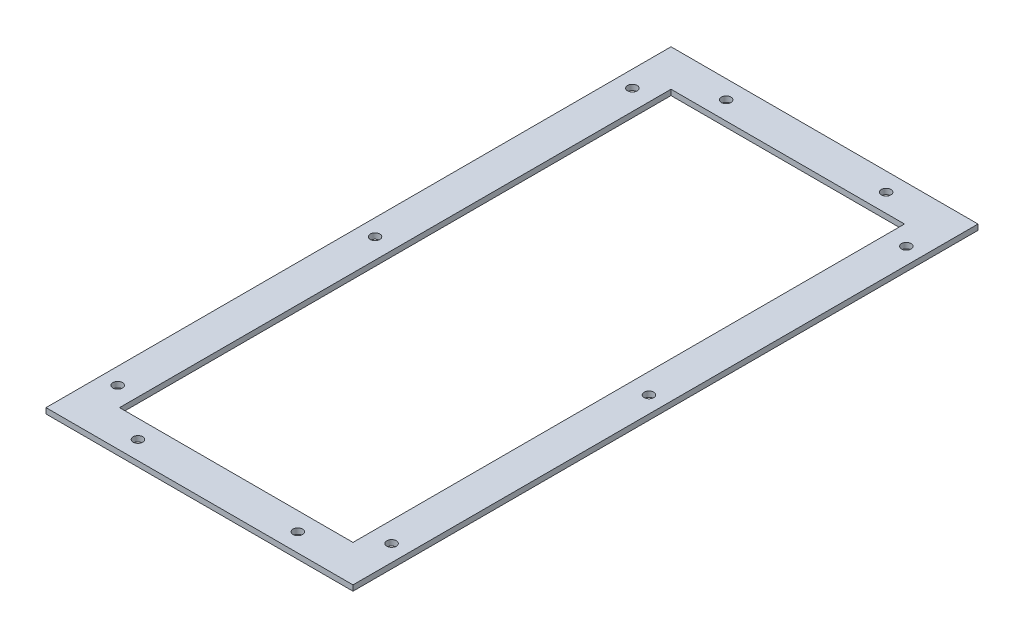
ISO-10303-21;
HEADER;
FILE_DESCRIPTION(('STEP AP214'),'2;1');
FILE_NAME('part.step','',(''),(''),'','','');
FILE_SCHEMA(('AUTOMOTIVE_DESIGN { 1 0 10303 214 1 1 1 1 }'));
ENDSEC;
DATA;
#1=APPLICATION_CONTEXT('core data for automotive mechanical design processes');
#2=APPLICATION_PROTOCOL_DEFINITION('international standard','automotive_design',2000,#1);
#3=PRODUCT_CONTEXT('',#1,'mechanical');
#4=PRODUCT('Part','Part','',(#3));
#5=PRODUCT_RELATED_PRODUCT_CATEGORY('part','',(#4));
#6=PRODUCT_DEFINITION_FORMATION('','',#4);
#7=PRODUCT_DEFINITION_CONTEXT('part definition',#1,'design');
#8=PRODUCT_DEFINITION('design','',#6,#7);
#9=PRODUCT_DEFINITION_SHAPE('','',#8);
#10=(LENGTH_UNIT() NAMED_UNIT(*) SI_UNIT(.MILLI.,.METRE.));
#11=(NAMED_UNIT(*) PLANE_ANGLE_UNIT() SI_UNIT($,.RADIAN.));
#12=(NAMED_UNIT(*) SI_UNIT($,.STERADIAN.) SOLID_ANGLE_UNIT());
#13=UNCERTAINTY_MEASURE_WITH_UNIT(LENGTH_MEASURE(1.E-05),#10,'distance_accuracy_value','');
#14=(GEOMETRIC_REPRESENTATION_CONTEXT(3) GLOBAL_UNCERTAINTY_ASSIGNED_CONTEXT((#13)) GLOBAL_UNIT_ASSIGNED_CONTEXT((#10,
#11,#12)) REPRESENTATION_CONTEXT('',''));
#15=CARTESIAN_POINT('',(0.,0.,0.));
#16=DIRECTION('',(0.,0.,1.));
#17=DIRECTION('',(1.,0.,0.));
#18=AXIS2_PLACEMENT_3D('',#15,#16,#17);
#19=CARTESIAN_POINT('',(0.,3.,0.));
#20=DIRECTION('',(0.,1.,0.));
#21=DIRECTION('',(0.,0.,1.));
#22=AXIS2_PLACEMENT_3D('',#19,#20,#21);
#23=PLANE('',#22);
#24=DIRECTION('',(-1.,0.,0.));
#25=VECTOR('',#24,1.);
#26=CARTESIAN_POINT('',(63.5,3.,-150.));
#27=LINE('',#26,#25);
#28=CARTESIAN_POINT('',(63.5,3.,-150.));
#29=VERTEX_POINT('',#28);
#30=CARTESIAN_POINT('',(-63.5,3.,-150.));
#31=VERTEX_POINT('',#30);
#32=EDGE_CURVE('E52',#29,#31,#27,.T.);
#33=ORIENTED_EDGE('',*,*,#32,.F.);
#34=DIRECTION('',(0.,0.,-1.));
#35=VECTOR('',#34,1.);
#36=CARTESIAN_POINT('',(63.5,3.,150.));
#37=LINE('',#36,#35);
#38=CARTESIAN_POINT('',(63.5,3.,150.));
#39=VERTEX_POINT('',#38);
#40=EDGE_CURVE('E120',#39,#29,#37,.T.);
#41=ORIENTED_EDGE('',*,*,#40,.F.);
#42=DIRECTION('',(1.,0.,0.));
#43=VECTOR('',#42,1.);
#44=CARTESIAN_POINT('',(-63.5,3.,150.));
#45=LINE('',#44,#43);
#46=CARTESIAN_POINT('',(-63.5,3.,150.));
#47=VERTEX_POINT('',#46);
#48=EDGE_CURVE('E105',#47,#39,#45,.T.);
#49=ORIENTED_EDGE('',*,*,#48,.F.);
#50=DIRECTION('',(0.,0.,1.));
#51=VECTOR('',#50,1.);
#52=CARTESIAN_POINT('',(-63.5,3.,-150.));
#53=LINE('',#52,#51);
#54=EDGE_CURVE('E114',#31,#47,#53,.T.);
#55=ORIENTED_EDGE('',*,*,#54,.F.);
#56=EDGE_LOOP('',(#33,#41,#49,#55));
#57=FACE_BOUND('',#56,.T.);
#58=CARTESIAN_POINT('',(-43.5,3.,160.));
#59=DIRECTION('',(0.,1.,0.));
#60=DIRECTION('',(0.,0.,1.));
#61=AXIS2_PLACEMENT_3D('',#58,#59,#60);
#62=CIRCLE('',#61,2.59999999999998);
#63=CARTESIAN_POINT('',(-43.5,3.,162.6));
#64=VERTEX_POINT('',#63);
#65=EDGE_CURVE('E136',#64,#64,#62,.T.);
#66=ORIENTED_EDGE('',*,*,#65,.F.);
#67=EDGE_LOOP('',(#66));
#68=FACE_BOUND('',#67,.T.);
#69=CARTESIAN_POINT('',(-43.5,3.,-160.));
#70=DIRECTION('',(0.,1.,0.));
#71=DIRECTION('',(0.,0.,1.));
#72=AXIS2_PLACEMENT_3D('',#69,#70,#71);
#73=CIRCLE('',#72,2.59999999999997);
#74=CARTESIAN_POINT('',(-43.5,3.,-157.4));
#75=VERTEX_POINT('',#74);
#76=EDGE_CURVE('E148',#75,#75,#73,.T.);
#77=ORIENTED_EDGE('',*,*,#76,.F.);
#78=EDGE_LOOP('',(#77));
#79=FACE_BOUND('',#78,.T.);
#80=CARTESIAN_POINT('',(74.5000000000001,3.,0.));
#81=DIRECTION('',(0.,1.,0.));
#82=DIRECTION('',(0.,0.,1.));
#83=AXIS2_PLACEMENT_3D('',#80,#81,#82);
#84=CIRCLE('',#83,2.6);
#85=CARTESIAN_POINT('',(74.5000000000001,3.,2.6));
#86=VERTEX_POINT('',#85);
#87=EDGE_CURVE('E160',#86,#86,#84,.T.);
#88=ORIENTED_EDGE('',*,*,#87,.F.);
#89=EDGE_LOOP('',(#88));
#90=FACE_BOUND('',#89,.T.);
#91=CARTESIAN_POINT('',(-74.5,3.,140.));
#92=DIRECTION('',(0.,1.,0.));
#93=DIRECTION('',(0.,0.,1.));
#94=AXIS2_PLACEMENT_3D('',#91,#92,#93);
#95=CIRCLE('',#94,2.6);
#96=CARTESIAN_POINT('',(-74.5,3.,142.6));
#97=VERTEX_POINT('',#96);
#98=EDGE_CURVE('E172',#97,#97,#95,.T.);
#99=ORIENTED_EDGE('',*,*,#98,.F.);
#100=EDGE_LOOP('',(#99));
#101=FACE_BOUND('',#100,.T.);
#102=CARTESIAN_POINT('',(-74.5000000000001,3.,-140.));
#103=DIRECTION('',(0.,1.,0.));
#104=DIRECTION('',(0.,0.,1.));
#105=AXIS2_PLACEMENT_3D('',#102,#103,#104);
#106=CIRCLE('',#105,2.6);
#107=CARTESIAN_POINT('',(-74.5000000000001,3.,-137.4));
#108=VERTEX_POINT('',#107);
#109=EDGE_CURVE('E184',#108,#108,#106,.T.);
#110=ORIENTED_EDGE('',*,*,#109,.F.);
#111=EDGE_LOOP('',(#110));
#112=FACE_BOUND('',#111,.T.);
#113=DIRECTION('',(0.,0.,1.));
#114=VECTOR('',#113,1.);
#115=CARTESIAN_POINT('',(-83.5,3.,-170.));
#116=LINE('',#115,#114);
#117=CARTESIAN_POINT('',(-83.5,3.,-170.));
#118=VERTEX_POINT('',#117);
#119=CARTESIAN_POINT('',(-83.5,3.,170.));
#120=VERTEX_POINT('',#119);
#121=EDGE_CURVE('E190',#118,#120,#116,.T.);
#122=ORIENTED_EDGE('',*,*,#121,.T.);
#123=DIRECTION('',(1.,0.,0.));
#124=VECTOR('',#123,1.);
#125=CARTESIAN_POINT('',(-83.5,3.,170.));
#126=LINE('',#125,#124);
#127=CARTESIAN_POINT('',(83.5,3.,170.));
#128=VERTEX_POINT('',#127);
#129=EDGE_CURVE('E193',#120,#128,#126,.T.);
#130=ORIENTED_EDGE('',*,*,#129,.T.);
#131=DIRECTION('',(0.,0.,-1.));
#132=VECTOR('',#131,1.);
#133=CARTESIAN_POINT('',(83.5,3.,-170.));
#134=LINE('',#133,#132);
#135=CARTESIAN_POINT('',(83.5,3.,-170.));
#136=VERTEX_POINT('',#135);
#137=EDGE_CURVE('E196',#128,#136,#134,.T.);
#138=ORIENTED_EDGE('',*,*,#137,.T.);
#139=DIRECTION('',(-1.,0.,0.));
#140=VECTOR('',#139,1.);
#141=CARTESIAN_POINT('',(-83.5,3.,-170.));
#142=LINE('',#141,#140);
#143=EDGE_CURVE('E198',#136,#118,#142,.T.);
#144=ORIENTED_EDGE('',*,*,#143,.T.);
#145=EDGE_LOOP('',(#122,#130,#138,#144));
#146=FACE_BOUND('',#145,.T.);
#147=CARTESIAN_POINT('',(-74.5,3.,0.));
#148=DIRECTION('',(0.,1.,0.));
#149=DIRECTION('',(0.,0.,1.));
#150=AXIS2_PLACEMENT_3D('',#147,#148,#149);
#151=CIRCLE('',#150,2.6);
#152=CARTESIAN_POINT('',(-74.5,3.,2.6));
#153=VERTEX_POINT('',#152);
#154=EDGE_CURVE('E178',#153,#153,#151,.T.);
#155=ORIENTED_EDGE('',*,*,#154,.F.);
#156=EDGE_LOOP('',(#155));
#157=FACE_BOUND('',#156,.T.);
#158=CARTESIAN_POINT('',(74.5000000000001,3.,-140.));
#159=DIRECTION('',(0.,1.,0.));
#160=DIRECTION('',(0.,0.,1.));
#161=AXIS2_PLACEMENT_3D('',#158,#159,#160);
#162=CIRCLE('',#161,2.6);
#163=CARTESIAN_POINT('',(74.5000000000001,3.,-137.4));
#164=VERTEX_POINT('',#163);
#165=EDGE_CURVE('E166',#164,#164,#162,.T.);
#166=ORIENTED_EDGE('',*,*,#165,.F.);
#167=EDGE_LOOP('',(#166));
#168=FACE_BOUND('',#167,.T.);
#169=CARTESIAN_POINT('',(74.5000000000001,3.,140.));
#170=DIRECTION('',(0.,1.,0.));
#171=DIRECTION('',(0.,0.,1.));
#172=AXIS2_PLACEMENT_3D('',#169,#170,#171);
#173=CIRCLE('',#172,2.6);
#174=CARTESIAN_POINT('',(74.5000000000001,3.,142.6));
#175=VERTEX_POINT('',#174);
#176=EDGE_CURVE('E154',#175,#175,#173,.T.);
#177=ORIENTED_EDGE('',*,*,#176,.F.);
#178=EDGE_LOOP('',(#177));
#179=FACE_BOUND('',#178,.T.);
#180=CARTESIAN_POINT('',(43.5000000000001,3.,-160.));
#181=DIRECTION('',(0.,1.,0.));
#182=DIRECTION('',(0.,0.,1.));
#183=AXIS2_PLACEMENT_3D('',#180,#181,#182);
#184=CIRCLE('',#183,2.59999999999997);
#185=CARTESIAN_POINT('',(43.5000000000001,3.,-157.4));
#186=VERTEX_POINT('',#185);
#187=EDGE_CURVE('E142',#186,#186,#184,.T.);
#188=ORIENTED_EDGE('',*,*,#187,.F.);
#189=EDGE_LOOP('',(#188));
#190=FACE_BOUND('',#189,.T.);
#191=CARTESIAN_POINT('',(43.5000000000001,3.,160.));
#192=DIRECTION('',(0.,1.,0.));
#193=DIRECTION('',(0.,0.,1.));
#194=AXIS2_PLACEMENT_3D('',#191,#192,#193);
#195=CIRCLE('',#194,2.59999999999997);
#196=CARTESIAN_POINT('',(43.5000000000001,3.,162.6));
#197=VERTEX_POINT('',#196);
#198=EDGE_CURVE('E130',#197,#197,#195,.T.);
#199=ORIENTED_EDGE('',*,*,#198,.F.);
#200=EDGE_LOOP('',(#199));
#201=FACE_BOUND('',#200,.T.);
#202=ADVANCED_FACE('F37',(#57,#68,#79,#90,#101,#112,#146,#157,#168,#179,#190,#201),#23,.T.);
#203=CARTESIAN_POINT('',(0.,0.,0.));
#204=DIRECTION('',(0.,1.,0.));
#205=DIRECTION('',(0.,0.,1.));
#206=AXIS2_PLACEMENT_3D('',#203,#204,#205);
#207=PLANE('',#206);
#208=DIRECTION('',(0.,0.,-1.));
#209=VECTOR('',#208,1.);
#210=CARTESIAN_POINT('',(63.5,0.,0.));
#211=LINE('',#210,#209);
#212=CARTESIAN_POINT('',(63.5,0.,150.));
#213=VERTEX_POINT('',#212);
#214=CARTESIAN_POINT('',(63.5,0.,-150.));
#215=VERTEX_POINT('',#214);
#216=EDGE_CURVE('E45',#213,#215,#211,.T.);
#217=ORIENTED_EDGE('',*,*,#216,.T.);
#218=DIRECTION('',(-1.,0.,0.));
#219=VECTOR('',#218,1.);
#220=CARTESIAN_POINT('',(0.,0.,-150.));
#221=LINE('',#220,#219);
#222=CARTESIAN_POINT('',(-63.5,0.,-150.));
#223=VERTEX_POINT('',#222);
#224=EDGE_CURVE('E11',#215,#223,#221,.T.);
#225=ORIENTED_EDGE('',*,*,#224,.T.);
#226=DIRECTION('',(0.,0.,1.));
#227=VECTOR('',#226,1.);
#228=CARTESIAN_POINT('',(-63.5,0.,0.));
#229=LINE('',#228,#227);
#230=CARTESIAN_POINT('',(-63.5,0.,150.));
#231=VERTEX_POINT('',#230);
#232=EDGE_CURVE('E219',#223,#231,#229,.T.);
#233=ORIENTED_EDGE('',*,*,#232,.T.);
#234=DIRECTION('',(1.,0.,0.));
#235=VECTOR('',#234,1.);
#236=CARTESIAN_POINT('',(0.,0.,150.));
#237=LINE('',#236,#235);
#238=EDGE_CURVE('E108',#231,#213,#237,.T.);
#239=ORIENTED_EDGE('',*,*,#238,.T.);
#240=EDGE_LOOP('',(#217,#225,#233,#239));
#241=FACE_BOUND('',#240,.T.);
#242=DIRECTION('',(0.,0.,1.));
#243=VECTOR('',#242,1.);
#244=CARTESIAN_POINT('',(-83.5,0.,-170.));
#245=LINE('',#244,#243);
#246=CARTESIAN_POINT('',(-83.5,0.,-170.));
#247=VERTEX_POINT('',#246);
#248=CARTESIAN_POINT('',(-83.5,0.,170.));
#249=VERTEX_POINT('',#248);
#250=EDGE_CURVE('E187',#247,#249,#245,.T.);
#251=ORIENTED_EDGE('',*,*,#250,.F.);
#252=DIRECTION('',(-1.,0.,0.));
#253=VECTOR('',#252,1.);
#254=CARTESIAN_POINT('',(-83.5,0.,-170.));
#255=LINE('',#254,#253);
#256=CARTESIAN_POINT('',(83.5,0.,-170.));
#257=VERTEX_POINT('',#256);
#258=EDGE_CURVE('E194',#257,#247,#255,.T.);
#259=ORIENTED_EDGE('',*,*,#258,.F.);
#260=DIRECTION('',(0.,0.,-1.));
#261=VECTOR('',#260,1.);
#262=CARTESIAN_POINT('',(83.5,0.,-170.));
#263=LINE('',#262,#261);
#264=CARTESIAN_POINT('',(83.5,0.,170.));
#265=VERTEX_POINT('',#264);
#266=EDGE_CURVE('E205',#265,#257,#263,.T.);
#267=ORIENTED_EDGE('',*,*,#266,.F.);
#268=DIRECTION('',(1.,0.,0.));
#269=VECTOR('',#268,1.);
#270=CARTESIAN_POINT('',(-83.5,0.,170.));
#271=LINE('',#270,#269);
#272=EDGE_CURVE('E203',#249,#265,#271,.T.);
#273=ORIENTED_EDGE('',*,*,#272,.F.);
#274=EDGE_LOOP('',(#251,#259,#267,#273));
#275=FACE_BOUND('',#274,.T.);
#276=CARTESIAN_POINT('',(-74.5000000000001,0.,-140.));
#277=DIRECTION('',(0.,1.,0.));
#278=DIRECTION('',(0.,0.,1.));
#279=AXIS2_PLACEMENT_3D('',#276,#277,#278);
#280=CIRCLE('',#279,2.6);
#281=CARTESIAN_POINT('',(-74.5000000000001,0.,-137.4));
#282=VERTEX_POINT('',#281);
#283=EDGE_CURVE('E181',#282,#282,#280,.T.);
#284=ORIENTED_EDGE('',*,*,#283,.T.);
#285=EDGE_LOOP('',(#284));
#286=FACE_BOUND('',#285,.T.);
#287=CARTESIAN_POINT('',(-74.5,0.,0.));
#288=DIRECTION('',(0.,1.,0.));
#289=DIRECTION('',(0.,0.,1.));
#290=AXIS2_PLACEMENT_3D('',#287,#288,#289);
#291=CIRCLE('',#290,2.6);
#292=CARTESIAN_POINT('',(-74.5,0.,2.6));
#293=VERTEX_POINT('',#292);
#294=EDGE_CURVE('E175',#293,#293,#291,.T.);
#295=ORIENTED_EDGE('',*,*,#294,.T.);
#296=EDGE_LOOP('',(#295));
#297=FACE_BOUND('',#296,.T.);
#298=CARTESIAN_POINT('',(-74.5,0.,140.));
#299=DIRECTION('',(0.,1.,0.));
#300=DIRECTION('',(0.,0.,1.));
#301=AXIS2_PLACEMENT_3D('',#298,#299,#300);
#302=CIRCLE('',#301,2.6);
#303=CARTESIAN_POINT('',(-74.5,0.,142.6));
#304=VERTEX_POINT('',#303);
#305=EDGE_CURVE('E169',#304,#304,#302,.T.);
#306=ORIENTED_EDGE('',*,*,#305,.T.);
#307=EDGE_LOOP('',(#306));
#308=FACE_BOUND('',#307,.T.);
#309=CARTESIAN_POINT('',(74.5000000000001,0.,-140.));
#310=DIRECTION('',(0.,1.,0.));
#311=DIRECTION('',(0.,0.,1.));
#312=AXIS2_PLACEMENT_3D('',#309,#310,#311);
#313=CIRCLE('',#312,2.6);
#314=CARTESIAN_POINT('',(74.5000000000001,0.,-137.4));
#315=VERTEX_POINT('',#314);
#316=EDGE_CURVE('E163',#315,#315,#313,.T.);
#317=ORIENTED_EDGE('',*,*,#316,.T.);
#318=EDGE_LOOP('',(#317));
#319=FACE_BOUND('',#318,.T.);
#320=CARTESIAN_POINT('',(74.5000000000001,0.,0.));
#321=DIRECTION('',(0.,1.,0.));
#322=DIRECTION('',(0.,0.,1.));
#323=AXIS2_PLACEMENT_3D('',#320,#321,#322);
#324=CIRCLE('',#323,2.6);
#325=CARTESIAN_POINT('',(74.5000000000001,0.,2.6));
#326=VERTEX_POINT('',#325);
#327=EDGE_CURVE('E157',#326,#326,#324,.T.);
#328=ORIENTED_EDGE('',*,*,#327,.T.);
#329=EDGE_LOOP('',(#328));
#330=FACE_BOUND('',#329,.T.);
#331=CARTESIAN_POINT('',(74.5000000000001,0.,140.));
#332=DIRECTION('',(0.,1.,0.));
#333=DIRECTION('',(0.,0.,1.));
#334=AXIS2_PLACEMENT_3D('',#331,#332,#333);
#335=CIRCLE('',#334,2.6);
#336=CARTESIAN_POINT('',(74.5000000000001,0.,142.6));
#337=VERTEX_POINT('',#336);
#338=EDGE_CURVE('E151',#337,#337,#335,.T.);
#339=ORIENTED_EDGE('',*,*,#338,.T.);
#340=EDGE_LOOP('',(#339));
#341=FACE_BOUND('',#340,.T.);
#342=CARTESIAN_POINT('',(-43.5,0.,-160.));
#343=DIRECTION('',(0.,1.,0.));
#344=DIRECTION('',(0.,0.,1.));
#345=AXIS2_PLACEMENT_3D('',#342,#343,#344);
#346=CIRCLE('',#345,2.59999999999997);
#347=CARTESIAN_POINT('',(-43.5,0.,-157.4));
#348=VERTEX_POINT('',#347);
#349=EDGE_CURVE('E145',#348,#348,#346,.T.);
#350=ORIENTED_EDGE('',*,*,#349,.T.);
#351=EDGE_LOOP('',(#350));
#352=FACE_BOUND('',#351,.T.);
#353=CARTESIAN_POINT('',(43.5000000000001,0.,-160.));
#354=DIRECTION('',(0.,1.,0.));
#355=DIRECTION('',(0.,0.,1.));
#356=AXIS2_PLACEMENT_3D('',#353,#354,#355);
#357=CIRCLE('',#356,2.59999999999997);
#358=CARTESIAN_POINT('',(43.5000000000001,0.,-157.4));
#359=VERTEX_POINT('',#358);
#360=EDGE_CURVE('E139',#359,#359,#357,.T.);
#361=ORIENTED_EDGE('',*,*,#360,.T.);
#362=EDGE_LOOP('',(#361));
#363=FACE_BOUND('',#362,.T.);
#364=CARTESIAN_POINT('',(-43.5,0.,160.));
#365=DIRECTION('',(0.,1.,0.));
#366=DIRECTION('',(0.,0.,1.));
#367=AXIS2_PLACEMENT_3D('',#364,#365,#366);
#368=CIRCLE('',#367,2.59999999999998);
#369=CARTESIAN_POINT('',(-43.5,0.,162.6));
#370=VERTEX_POINT('',#369);
#371=EDGE_CURVE('E133',#370,#370,#368,.T.);
#372=ORIENTED_EDGE('',*,*,#371,.T.);
#373=EDGE_LOOP('',(#372));
#374=FACE_BOUND('',#373,.T.);
#375=CARTESIAN_POINT('',(43.5000000000001,0.,160.));
#376=DIRECTION('',(0.,1.,0.));
#377=DIRECTION('',(0.,0.,1.));
#378=AXIS2_PLACEMENT_3D('',#375,#376,#377);
#379=CIRCLE('',#378,2.59999999999997);
#380=CARTESIAN_POINT('',(43.5000000000001,0.,162.6));
#381=VERTEX_POINT('',#380);
#382=EDGE_CURVE('E127',#381,#381,#379,.T.);
#383=ORIENTED_EDGE('',*,*,#382,.T.);
#384=EDGE_LOOP('',(#383));
#385=FACE_BOUND('',#384,.T.);
#386=ADVANCED_FACE('F223',(#241,#275,#286,#297,#308,#319,#330,#341,#352,#363,#374,#385),#207,.F.);
#387=CARTESIAN_POINT('',(-83.5,3.,-170.));
#388=DIRECTION('',(1.,0.,0.));
#389=DIRECTION('',(0.,0.,-1.));
#390=AXIS2_PLACEMENT_3D('',#387,#388,#389);
#391=PLANE('',#390);
#392=ORIENTED_EDGE('',*,*,#250,.T.);
#393=DIRECTION('',(0.,-1.,0.));
#394=VECTOR('',#393,1.);
#395=CARTESIAN_POINT('',(-83.5,3.,170.));
#396=LINE('',#395,#394);
#397=EDGE_CURVE('E216',#120,#249,#396,.T.);
#398=ORIENTED_EDGE('',*,*,#397,.F.);
#399=ORIENTED_EDGE('',*,*,#121,.F.);
#400=DIRECTION('',(0.,-1.,0.));
#401=VECTOR('',#400,1.);
#402=CARTESIAN_POINT('',(-83.5,3.,-170.));
#403=LINE('',#402,#401);
#404=EDGE_CURVE('E200',#118,#247,#403,.T.);
#405=ORIENTED_EDGE('',*,*,#404,.T.);
#406=EDGE_LOOP('',(#392,#398,#399,#405));
#407=FACE_BOUND('',#406,.T.);
#408=ADVANCED_FACE('F39',(#407),#391,.F.);
#409=CARTESIAN_POINT('',(-83.5,3.,170.));
#410=DIRECTION('',(0.,0.,-1.));
#411=DIRECTION('',(-1.,0.,0.));
#412=AXIS2_PLACEMENT_3D('',#409,#410,#411);
#413=PLANE('',#412);
#414=ORIENTED_EDGE('',*,*,#272,.T.);
#415=DIRECTION('',(0.,-1.,0.));
#416=VECTOR('',#415,1.);
#417=CARTESIAN_POINT('',(83.5,3.,170.));
#418=LINE('',#417,#416);
#419=EDGE_CURVE('E213',#128,#265,#418,.T.);
#420=ORIENTED_EDGE('',*,*,#419,.F.);
#421=ORIENTED_EDGE('',*,*,#129,.F.);
#422=ORIENTED_EDGE('',*,*,#397,.T.);
#423=EDGE_LOOP('',(#414,#420,#421,#422));
#424=FACE_BOUND('',#423,.T.);
#425=ADVANCED_FACE('F258',(#424),#413,.F.);
#426=CARTESIAN_POINT('',(83.5,3.,-170.));
#427=DIRECTION('',(-1.,0.,0.));
#428=DIRECTION('',(0.,0.,1.));
#429=AXIS2_PLACEMENT_3D('',#426,#427,#428);
#430=PLANE('',#429);
#431=ORIENTED_EDGE('',*,*,#266,.T.);
#432=DIRECTION('',(0.,-1.,0.));
#433=VECTOR('',#432,1.);
#434=CARTESIAN_POINT('',(83.5,3.,-170.));
#435=LINE('',#434,#433);
#436=EDGE_CURVE('E210',#136,#257,#435,.T.);
#437=ORIENTED_EDGE('',*,*,#436,.F.);
#438=ORIENTED_EDGE('',*,*,#137,.F.);
#439=ORIENTED_EDGE('',*,*,#419,.T.);
#440=EDGE_LOOP('',(#431,#437,#438,#439));
#441=FACE_BOUND('',#440,.T.);
#442=ADVANCED_FACE('F255',(#441),#430,.F.);
#443=CARTESIAN_POINT('',(-83.5,3.,-170.));
#444=DIRECTION('',(0.,0.,1.));
#445=DIRECTION('',(1.,0.,0.));
#446=AXIS2_PLACEMENT_3D('',#443,#444,#445);
#447=PLANE('',#446);
#448=ORIENTED_EDGE('',*,*,#258,.T.);
#449=ORIENTED_EDGE('',*,*,#404,.F.);
#450=ORIENTED_EDGE('',*,*,#143,.F.);
#451=ORIENTED_EDGE('',*,*,#436,.T.);
#452=EDGE_LOOP('',(#448,#449,#450,#451));
#453=FACE_BOUND('',#452,.T.);
#454=ADVANCED_FACE('F252',(#453),#447,.F.);
#455=CARTESIAN_POINT('',(-74.5000000000001,3.,-140.));
#456=DIRECTION('',(0.,-1.,0.));
#457=DIRECTION('',(0.,0.,-1.));
#458=AXIS2_PLACEMENT_3D('',#455,#456,#457);
#459=CYLINDRICAL_SURFACE('',#458,2.6);
#460=ORIENTED_EDGE('',*,*,#109,.T.);
#461=EDGE_LOOP('',(#460));
#462=FACE_BOUND('',#461,.T.);
#463=ORIENTED_EDGE('',*,*,#283,.F.);
#464=EDGE_LOOP('',(#463));
#465=FACE_BOUND('',#464,.T.);
#466=ADVANCED_FACE('F249',(#462,#465),#459,.F.);
#467=CARTESIAN_POINT('',(-74.5,3.,0.));
#468=DIRECTION('',(0.,-1.,0.));
#469=DIRECTION('',(0.,0.,-1.));
#470=AXIS2_PLACEMENT_3D('',#467,#468,#469);
#471=CYLINDRICAL_SURFACE('',#470,2.6);
#472=ORIENTED_EDGE('',*,*,#154,.T.);
#473=EDGE_LOOP('',(#472));
#474=FACE_BOUND('',#473,.T.);
#475=ORIENTED_EDGE('',*,*,#294,.F.);
#476=EDGE_LOOP('',(#475));
#477=FACE_BOUND('',#476,.T.);
#478=ADVANCED_FACE('F325',(#474,#477),#471,.F.);
#479=CARTESIAN_POINT('',(-74.5,3.,140.));
#480=DIRECTION('',(0.,-1.,0.));
#481=DIRECTION('',(0.,0.,-1.));
#482=AXIS2_PLACEMENT_3D('',#479,#480,#481);
#483=CYLINDRICAL_SURFACE('',#482,2.6);
#484=ORIENTED_EDGE('',*,*,#98,.T.);
#485=EDGE_LOOP('',(#484));
#486=FACE_BOUND('',#485,.T.);
#487=ORIENTED_EDGE('',*,*,#305,.F.);
#488=EDGE_LOOP('',(#487));
#489=FACE_BOUND('',#488,.T.);
#490=ADVANCED_FACE('F322',(#486,#489),#483,.F.);
#491=CARTESIAN_POINT('',(74.5000000000001,3.,-140.));
#492=DIRECTION('',(0.,-1.,0.));
#493=DIRECTION('',(0.,0.,-1.));
#494=AXIS2_PLACEMENT_3D('',#491,#492,#493);
#495=CYLINDRICAL_SURFACE('',#494,2.6);
#496=ORIENTED_EDGE('',*,*,#165,.T.);
#497=EDGE_LOOP('',(#496));
#498=FACE_BOUND('',#497,.T.);
#499=ORIENTED_EDGE('',*,*,#316,.F.);
#500=EDGE_LOOP('',(#499));
#501=FACE_BOUND('',#500,.T.);
#502=ADVANCED_FACE('F318',(#498,#501),#495,.F.);
#503=CARTESIAN_POINT('',(74.5000000000001,3.,0.));
#504=DIRECTION('',(0.,-1.,0.));
#505=DIRECTION('',(0.,0.,-1.));
#506=AXIS2_PLACEMENT_3D('',#503,#504,#505);
#507=CYLINDRICAL_SURFACE('',#506,2.6);
#508=ORIENTED_EDGE('',*,*,#87,.T.);
#509=EDGE_LOOP('',(#508));
#510=FACE_BOUND('',#509,.T.);
#511=ORIENTED_EDGE('',*,*,#327,.F.);
#512=EDGE_LOOP('',(#511));
#513=FACE_BOUND('',#512,.T.);
#514=ADVANCED_FACE('F314',(#510,#513),#507,.F.);
#515=CARTESIAN_POINT('',(74.5000000000001,3.,140.));
#516=DIRECTION('',(0.,-1.,0.));
#517=DIRECTION('',(0.,0.,-1.));
#518=AXIS2_PLACEMENT_3D('',#515,#516,#517);
#519=CYLINDRICAL_SURFACE('',#518,2.6);
#520=ORIENTED_EDGE('',*,*,#176,.T.);
#521=EDGE_LOOP('',(#520));
#522=FACE_BOUND('',#521,.T.);
#523=ORIENTED_EDGE('',*,*,#338,.F.);
#524=EDGE_LOOP('',(#523));
#525=FACE_BOUND('',#524,.T.);
#526=ADVANCED_FACE('F310',(#522,#525),#519,.F.);
#527=CARTESIAN_POINT('',(-43.5,3.,-160.));
#528=DIRECTION('',(0.,-1.,0.));
#529=DIRECTION('',(0.,0.,-1.));
#530=AXIS2_PLACEMENT_3D('',#527,#528,#529);
#531=CYLINDRICAL_SURFACE('',#530,2.59999999999997);
#532=ORIENTED_EDGE('',*,*,#76,.T.);
#533=EDGE_LOOP('',(#532));
#534=FACE_BOUND('',#533,.T.);
#535=ORIENTED_EDGE('',*,*,#349,.F.);
#536=EDGE_LOOP('',(#535));
#537=FACE_BOUND('',#536,.T.);
#538=ADVANCED_FACE('F295',(#534,#537),#531,.F.);
#539=CARTESIAN_POINT('',(43.5000000000001,3.,-160.));
#540=DIRECTION('',(0.,-1.,0.));
#541=DIRECTION('',(0.,0.,-1.));
#542=AXIS2_PLACEMENT_3D('',#539,#540,#541);
#543=CYLINDRICAL_SURFACE('',#542,2.59999999999997);
#544=ORIENTED_EDGE('',*,*,#187,.T.);
#545=EDGE_LOOP('',(#544));
#546=FACE_BOUND('',#545,.T.);
#547=ORIENTED_EDGE('',*,*,#360,.F.);
#548=EDGE_LOOP('',(#547));
#549=FACE_BOUND('',#548,.T.);
#550=ADVANCED_FACE('F292',(#546,#549),#543,.F.);
#551=CARTESIAN_POINT('',(-43.5,3.,160.));
#552=DIRECTION('',(0.,-1.,0.));
#553=DIRECTION('',(0.,0.,-1.));
#554=AXIS2_PLACEMENT_3D('',#551,#552,#553);
#555=CYLINDRICAL_SURFACE('',#554,2.59999999999998);
#556=ORIENTED_EDGE('',*,*,#65,.T.);
#557=EDGE_LOOP('',(#556));
#558=FACE_BOUND('',#557,.T.);
#559=ORIENTED_EDGE('',*,*,#371,.F.);
#560=EDGE_LOOP('',(#559));
#561=FACE_BOUND('',#560,.T.);
#562=ADVANCED_FACE('F237',(#558,#561),#555,.F.);
#563=CARTESIAN_POINT('',(43.5000000000001,3.,160.));
#564=DIRECTION('',(0.,-1.,0.));
#565=DIRECTION('',(0.,0.,-1.));
#566=AXIS2_PLACEMENT_3D('',#563,#564,#565);
#567=CYLINDRICAL_SURFACE('',#566,2.59999999999997);
#568=ORIENTED_EDGE('',*,*,#198,.T.);
#569=EDGE_LOOP('',(#568));
#570=FACE_BOUND('',#569,.T.);
#571=ORIENTED_EDGE('',*,*,#382,.F.);
#572=EDGE_LOOP('',(#571));
#573=FACE_BOUND('',#572,.T.);
#574=ADVANCED_FACE('F230',(#570,#573),#567,.F.);
#575=CARTESIAN_POINT('',(63.5,-7.,-150.));
#576=DIRECTION('',(0.,0.,-1.));
#577=DIRECTION('',(-1.,0.,0.));
#578=AXIS2_PLACEMENT_3D('',#575,#576,#577);
#579=PLANE('',#578);
#580=DIRECTION('',(0.,1.,0.));
#581=VECTOR('',#580,1.);
#582=CARTESIAN_POINT('',(63.5,-7.,-150.));
#583=LINE('',#582,#581);
#584=EDGE_CURVE('E125',#215,#29,#583,.T.);
#585=ORIENTED_EDGE('',*,*,#584,.T.);
#586=ORIENTED_EDGE('',*,*,#32,.T.);
#587=DIRECTION('',(0.,1.,0.));
#588=VECTOR('',#587,1.);
#589=CARTESIAN_POINT('',(-63.5,-7.,-150.));
#590=LINE('',#589,#588);
#591=EDGE_CURVE('E111',#223,#31,#590,.T.);
#592=ORIENTED_EDGE('',*,*,#591,.F.);
#593=ORIENTED_EDGE('',*,*,#224,.F.);
#594=EDGE_LOOP('',(#585,#586,#592,#593));
#595=FACE_BOUND('',#594,.T.);
#596=ADVANCED_FACE('F228',(#595),#579,.F.);
#597=CARTESIAN_POINT('',(63.5,-7.,150.));
#598=DIRECTION('',(1.,0.,0.));
#599=DIRECTION('',(0.,0.,-1.));
#600=AXIS2_PLACEMENT_3D('',#597,#598,#599);
#601=PLANE('',#600);
#602=DIRECTION('',(0.,1.,0.));
#603=VECTOR('',#602,1.);
#604=CARTESIAN_POINT('',(63.5,-7.,150.));
#605=LINE('',#604,#603);
#606=EDGE_CURVE('E110',#213,#39,#605,.T.);
#607=ORIENTED_EDGE('',*,*,#606,.T.);
#608=ORIENTED_EDGE('',*,*,#40,.T.);
#609=ORIENTED_EDGE('',*,*,#584,.F.);
#610=ORIENTED_EDGE('',*,*,#216,.F.);
#611=EDGE_LOOP('',(#607,#608,#609,#610));
#612=FACE_BOUND('',#611,.T.);
#613=ADVANCED_FACE('F227',(#612),#601,.F.);
#614=CARTESIAN_POINT('',(-63.5,-7.,150.));
#615=DIRECTION('',(0.,0.,1.));
#616=DIRECTION('',(1.,0.,0.));
#617=AXIS2_PLACEMENT_3D('',#614,#615,#616);
#618=PLANE('',#617);
#619=DIRECTION('',(0.,1.,0.));
#620=VECTOR('',#619,1.);
#621=CARTESIAN_POINT('',(-63.5,-7.,150.));
#622=LINE('',#621,#620);
#623=EDGE_CURVE('E60',#231,#47,#622,.T.);
#624=ORIENTED_EDGE('',*,*,#623,.T.);
#625=ORIENTED_EDGE('',*,*,#48,.T.);
#626=ORIENTED_EDGE('',*,*,#606,.F.);
#627=ORIENTED_EDGE('',*,*,#238,.F.);
#628=EDGE_LOOP('',(#624,#625,#626,#627));
#629=FACE_BOUND('',#628,.T.);
#630=ADVANCED_FACE('F102',(#629),#618,.F.);
#631=CARTESIAN_POINT('',(-63.5,-7.,-150.));
#632=DIRECTION('',(-1.,0.,0.));
#633=DIRECTION('',(0.,0.,1.));
#634=AXIS2_PLACEMENT_3D('',#631,#632,#633);
#635=PLANE('',#634);
#636=ORIENTED_EDGE('',*,*,#591,.T.);
#637=ORIENTED_EDGE('',*,*,#54,.T.);
#638=ORIENTED_EDGE('',*,*,#623,.F.);
#639=ORIENTED_EDGE('',*,*,#232,.F.);
#640=EDGE_LOOP('',(#636,#637,#638,#639));
#641=FACE_BOUND('',#640,.T.);
#642=ADVANCED_FACE('F115',(#641),#635,.F.);
#643=CLOSED_SHELL('',(#202,#386,#408,#425,#442,#454,#466,#478,#490,#502,#514,#526,#538,#550,
#562,#574,#596,#613,#630,#642));
#644=MANIFOLD_SOLID_BREP('B2',#643);
#645=ADVANCED_BREP_SHAPE_REPRESENTATION('',(#18,#644),#14);
#646=SHAPE_DEFINITION_REPRESENTATION(#9,#645);
ENDSEC;
END-ISO-10303-21;
